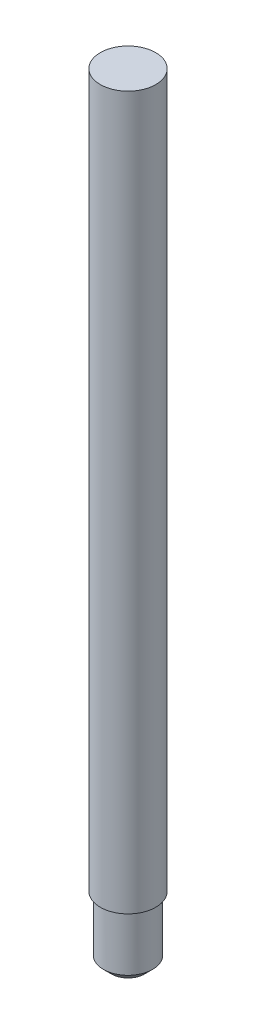
ISO-10303-21;
HEADER;
FILE_DESCRIPTION(('STEP AP214'),'2;1');
FILE_NAME('part.step','',(''),(''),'','','');
FILE_SCHEMA(('AUTOMOTIVE_DESIGN { 1 0 10303 214 1 1 1 1 }'));
ENDSEC;
DATA;
#1=APPLICATION_CONTEXT('core data for automotive mechanical design processes');
#2=APPLICATION_PROTOCOL_DEFINITION('international standard','automotive_design',2000,#1);
#3=PRODUCT_CONTEXT('',#1,'mechanical');
#4=PRODUCT('Part','Part','',(#3));
#5=PRODUCT_RELATED_PRODUCT_CATEGORY('part','',(#4));
#6=PRODUCT_DEFINITION_FORMATION('','',#4);
#7=PRODUCT_DEFINITION_CONTEXT('part definition',#1,'design');
#8=PRODUCT_DEFINITION('design','',#6,#7);
#9=PRODUCT_DEFINITION_SHAPE('','',#8);
#10=(LENGTH_UNIT() NAMED_UNIT(*) SI_UNIT(.MILLI.,.METRE.));
#11=(NAMED_UNIT(*) PLANE_ANGLE_UNIT() SI_UNIT($,.RADIAN.));
#12=(NAMED_UNIT(*) SI_UNIT($,.STERADIAN.) SOLID_ANGLE_UNIT());
#13=UNCERTAINTY_MEASURE_WITH_UNIT(LENGTH_MEASURE(1.E-05),#10,'distance_accuracy_value','');
#14=(GEOMETRIC_REPRESENTATION_CONTEXT(3) GLOBAL_UNCERTAINTY_ASSIGNED_CONTEXT((#13)) GLOBAL_UNIT_ASSIGNED_CONTEXT((#10,
#11,#12)) REPRESENTATION_CONTEXT('',''));
#15=CARTESIAN_POINT('',(0.,0.,0.));
#16=DIRECTION('',(0.,0.,1.));
#17=DIRECTION('',(1.,0.,0.));
#18=AXIS2_PLACEMENT_3D('',#15,#16,#17);
#19=CARTESIAN_POINT('',(0.,49.,0.));
#20=DIRECTION('',(0.,-1.,0.));
#21=DIRECTION('',(0.,0.,-1.));
#22=AXIS2_PLACEMENT_3D('',#19,#20,#21);
#23=CYLINDRICAL_SURFACE('',#22,1.75);
#24=CARTESIAN_POINT('',(0.,49.,0.));
#25=DIRECTION('',(0.,1.,0.));
#26=DIRECTION('',(0.,0.,1.));
#27=AXIS2_PLACEMENT_3D('',#24,#25,#26);
#28=CIRCLE('',#27,1.75);
#29=CARTESIAN_POINT('',(0.,49.,1.75));
#30=VERTEX_POINT('',#29);
#31=EDGE_CURVE('E54',#30,#30,#28,.T.);
#32=ORIENTED_EDGE('',*,*,#31,.F.);
#33=EDGE_LOOP('',(#32));
#34=FACE_BOUND('',#33,.T.);
#35=CARTESIAN_POINT('',(0.,4.,0.));
#36=DIRECTION('',(0.,-1.,0.));
#37=DIRECTION('',(0.,0.,-1.));
#38=AXIS2_PLACEMENT_3D('',#35,#36,#37);
#39=CIRCLE('',#38,1.75);
#40=CARTESIAN_POINT('',(0.,4.,-1.75));
#41=VERTEX_POINT('',#40);
#42=EDGE_CURVE('E60',#41,#41,#39,.T.);
#43=ORIENTED_EDGE('',*,*,#42,.F.);
#44=EDGE_LOOP('',(#43));
#45=FACE_BOUND('',#44,.T.);
#46=ADVANCED_FACE('F39',(#34,#45),#23,.T.);
#47=CARTESIAN_POINT('',(0.,49.,0.));
#48=DIRECTION('',(0.,1.,0.));
#49=DIRECTION('',(0.,0.,1.));
#50=AXIS2_PLACEMENT_3D('',#47,#48,#49);
#51=PLANE('',#50);
#52=ORIENTED_EDGE('',*,*,#31,.T.);
#53=EDGE_LOOP('',(#52));
#54=FACE_BOUND('',#53,.T.);
#55=ADVANCED_FACE('F74',(#54),#51,.T.);
#56=CARTESIAN_POINT('',(0.,4.,0.));
#57=DIRECTION('',(0.,-1.,0.));
#58=DIRECTION('',(0.,0.,-1.));
#59=AXIS2_PLACEMENT_3D('',#56,#57,#58);
#60=PLANE('',#59);
#61=CARTESIAN_POINT('',(0.,4.,0.));
#62=DIRECTION('',(0.,-1.,0.));
#63=DIRECTION('',(0.,0.,-1.));
#64=AXIS2_PLACEMENT_3D('',#61,#62,#63);
#65=CIRCLE('',#64,1.55);
#66=CARTESIAN_POINT('',(0.,4.,-1.55));
#67=VERTEX_POINT('',#66);
#68=EDGE_CURVE('E64',#67,#67,#65,.T.);
#69=ORIENTED_EDGE('',*,*,#68,.F.);
#70=EDGE_LOOP('',(#69));
#71=FACE_BOUND('',#70,.T.);
#72=ORIENTED_EDGE('',*,*,#42,.T.);
#73=EDGE_LOOP('',(#72));
#74=FACE_BOUND('',#73,.T.);
#75=ADVANCED_FACE('F71',(#71,#74),#60,.T.);
#76=CARTESIAN_POINT('',(0.,4.,0.));
#77=DIRECTION('',(0.,-1.,0.));
#78=DIRECTION('',(0.,0.,-1.));
#79=AXIS2_PLACEMENT_3D('',#76,#77,#78);
#80=CYLINDRICAL_SURFACE('',#79,1.55);
#81=CARTESIAN_POINT('',(0.,0.500000000000003,0.));
#82=DIRECTION('',(0.,1.,0.));
#83=DIRECTION('',(0.,0.,1.));
#84=AXIS2_PLACEMENT_3D('',#81,#82,#83);
#85=CIRCLE('',#84,1.55);
#86=CARTESIAN_POINT('',(0.,0.500000000000003,1.55));
#87=VERTEX_POINT('',#86);
#88=EDGE_CURVE('E10',#87,#87,#85,.T.);
#89=ORIENTED_EDGE('',*,*,#88,.T.);
#90=EDGE_LOOP('',(#89));
#91=FACE_BOUND('',#90,.T.);
#92=ORIENTED_EDGE('',*,*,#68,.T.);
#93=EDGE_LOOP('',(#92));
#94=FACE_BOUND('',#93,.T.);
#95=ADVANCED_FACE('F69',(#91,#94),#80,.T.);
#96=CARTESIAN_POINT('',(0.,0.,0.));
#97=DIRECTION('',(0.,1.,0.));
#98=DIRECTION('',(0.,0.,1.));
#99=AXIS2_PLACEMENT_3D('',#96,#97,#98);
#100=PLANE('',#99);
#101=CARTESIAN_POINT('',(0.,0.,0.));
#102=DIRECTION('',(0.,1.,0.));
#103=DIRECTION('',(0.,0.,1.));
#104=AXIS2_PLACEMENT_3D('',#101,#102,#103);
#105=CIRCLE('',#104,1.05);
#106=CARTESIAN_POINT('',(0.,0.,1.05));
#107=VERTEX_POINT('',#106);
#108=EDGE_CURVE('E48',#107,#107,#105,.F.);
#109=ORIENTED_EDGE('',*,*,#108,.T.);
#110=EDGE_LOOP('',(#109));
#111=FACE_BOUND('',#110,.T.);
#112=ADVANCED_FACE('F87',(#111),#100,.F.);
#113=CARTESIAN_POINT('',(0.,0.,0.));
#114=DIRECTION('',(0.,1.,0.));
#115=DIRECTION('',(0.,0.,1.));
#116=AXIS2_PLACEMENT_3D('',#113,#114,#115);
#117=CONICAL_SURFACE('',#116,1.05,0.78539816339745);
#118=ORIENTED_EDGE('',*,*,#88,.F.);
#119=EDGE_LOOP('',(#118));
#120=FACE_BOUND('',#119,.T.);
#121=ORIENTED_EDGE('',*,*,#108,.F.);
#122=EDGE_LOOP('',(#121));
#123=FACE_BOUND('',#122,.T.);
#124=ADVANCED_FACE('F42',(#120,#123),#117,.T.);
#125=CLOSED_SHELL('',(#46,#55,#75,#95,#112,#124));
#126=MANIFOLD_SOLID_BREP('B2',#125);
#127=ADVANCED_BREP_SHAPE_REPRESENTATION('',(#18,#126),#14);
#128=SHAPE_DEFINITION_REPRESENTATION(#9,#127);
ENDSEC;
END-ISO-10303-21;
